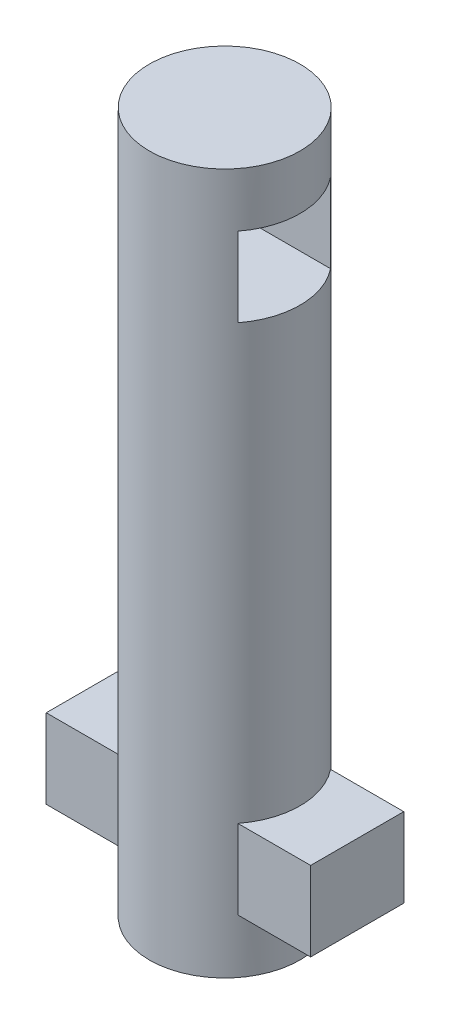
ISO-10303-21;
HEADER;
FILE_DESCRIPTION(('STEP AP214'),'2;1');
FILE_NAME('part.step','',(''),(''),'','','');
FILE_SCHEMA(('AUTOMOTIVE_DESIGN { 1 0 10303 214 1 1 1 1 }'));
ENDSEC;
DATA;
#1=APPLICATION_CONTEXT('core data for automotive mechanical design processes');
#2=APPLICATION_PROTOCOL_DEFINITION('international standard','automotive_design',2000,#1);
#3=PRODUCT_CONTEXT('',#1,'mechanical');
#4=PRODUCT('Part','Part','',(#3));
#5=PRODUCT_RELATED_PRODUCT_CATEGORY('part','',(#4));
#6=PRODUCT_DEFINITION_FORMATION('','',#4);
#7=PRODUCT_DEFINITION_CONTEXT('part definition',#1,'design');
#8=PRODUCT_DEFINITION('design','',#6,#7);
#9=PRODUCT_DEFINITION_SHAPE('','',#8);
#10=(LENGTH_UNIT() NAMED_UNIT(*) SI_UNIT(.MILLI.,.METRE.));
#11=(NAMED_UNIT(*) PLANE_ANGLE_UNIT() SI_UNIT($,.RADIAN.));
#12=(NAMED_UNIT(*) SI_UNIT($,.STERADIAN.) SOLID_ANGLE_UNIT());
#13=UNCERTAINTY_MEASURE_WITH_UNIT(LENGTH_MEASURE(1.E-05),#10,'distance_accuracy_value','');
#14=(GEOMETRIC_REPRESENTATION_CONTEXT(3) GLOBAL_UNCERTAINTY_ASSIGNED_CONTEXT((#13)) GLOBAL_UNIT_ASSIGNED_CONTEXT((#10,
#11,#12)) REPRESENTATION_CONTEXT('',''));
#15=CARTESIAN_POINT('',(0.,0.,0.));
#16=DIRECTION('',(0.,0.,1.));
#17=DIRECTION('',(1.,0.,0.));
#18=AXIS2_PLACEMENT_3D('',#15,#16,#17);
#19=CARTESIAN_POINT('',(0.,53.,0.));
#20=DIRECTION('',(0.,-1.,0.));
#21=DIRECTION('',(0.,0.,-1.));
#22=AXIS2_PLACEMENT_3D('',#19,#20,#21);
#23=CYLINDRICAL_SURFACE('',#22,5.7);
#24=DIRECTION('',(0.,-1.,0.));
#25=VECTOR('',#24,1.);
#26=CARTESIAN_POINT('',(-4.4988887516808,53.,3.5));
#27=LINE('',#26,#25);
#28=CARTESIAN_POINT('',(-4.4988887516808,10.1,3.5));
#29=VERTEX_POINT('',#28);
#30=CARTESIAN_POINT('',(-4.4988887516808,4.1,3.5));
#31=VERTEX_POINT('',#30);
#32=EDGE_CURVE('E42',#29,#31,#27,.T.);
#33=ORIENTED_EDGE('',*,*,#32,.T.);
#34=CARTESIAN_POINT('',(0.,4.1,0.));
#35=DIRECTION('',(0.,-1.,0.));
#36=DIRECTION('',(0.,0.,-1.));
#37=AXIS2_PLACEMENT_3D('',#34,#35,#36);
#38=CIRCLE('',#37,5.7);
#39=CARTESIAN_POINT('',(-4.46310892252872,4.1,-3.54551247997303));
#40=VERTEX_POINT('',#39);
#41=EDGE_CURVE('E11',#31,#40,#38,.T.);
#42=ORIENTED_EDGE('',*,*,#41,.T.);
#43=DIRECTION('',(0.,-1.,0.));
#44=VECTOR('',#43,1.);
#45=CARTESIAN_POINT('',(-4.46310892252872,53.,-3.54551247997303));
#46=LINE('',#45,#44);
#47=CARTESIAN_POINT('',(-4.46310892252872,10.1,-3.54551247997303));
#48=VERTEX_POINT('',#47);
#49=EDGE_CURVE('E248',#48,#40,#46,.T.);
#50=ORIENTED_EDGE('',*,*,#49,.F.);
#51=CARTESIAN_POINT('',(0.,10.1,0.));
#52=DIRECTION('',(0.,-1.,0.));
#53=DIRECTION('',(0.,0.,-1.));
#54=AXIS2_PLACEMENT_3D('',#51,#52,#53);
#55=CIRCLE('',#54,5.7);
#56=EDGE_CURVE('E59',#29,#48,#55,.T.);
#57=ORIENTED_EDGE('',*,*,#56,.F.);
#58=EDGE_LOOP('',(#33,#42,#50,#57));
#59=FACE_BOUND('',#58,.T.);
#60=DIRECTION('',(0.,-1.,0.));
#61=VECTOR('',#60,1.);
#62=CARTESIAN_POINT('',(4.46310892252872,53.,-3.54551247997303));
#63=LINE('',#62,#61);
#64=CARTESIAN_POINT('',(4.46310892252872,4.1,-3.54551247997303));
#65=VERTEX_POINT('',#64);
#66=CARTESIAN_POINT('',(4.46310892252873,10.1,-3.54551247997303));
#67=VERTEX_POINT('',#66);
#68=EDGE_CURVE('E238',#65,#67,#63,.F.);
#69=ORIENTED_EDGE('',*,*,#68,.F.);
#70=CARTESIAN_POINT('',(4.4988887516808,4.1,3.5));
#71=VERTEX_POINT('',#70);
#72=EDGE_CURVE('E49',#65,#71,#38,.T.);
#73=ORIENTED_EDGE('',*,*,#72,.T.);
#74=DIRECTION('',(0.,-1.,0.));
#75=VECTOR('',#74,1.);
#76=CARTESIAN_POINT('',(4.4988887516808,53.,3.5));
#77=LINE('',#76,#75);
#78=CARTESIAN_POINT('',(4.4988887516808,10.1,3.5));
#79=VERTEX_POINT('',#78);
#80=EDGE_CURVE('E245',#71,#79,#77,.F.);
#81=ORIENTED_EDGE('',*,*,#80,.T.);
#82=EDGE_CURVE('E241',#67,#79,#55,.T.);
#83=ORIENTED_EDGE('',*,*,#82,.F.);
#84=EDGE_LOOP('',(#69,#73,#81,#83));
#85=FACE_BOUND('',#84,.T.);
#86=DIRECTION('',(0.,-1.,0.));
#87=VECTOR('',#86,1.);
#88=CARTESIAN_POINT('',(4.4988887516808,53.,3.5));
#89=LINE('',#88,#87);
#90=CARTESIAN_POINT('',(4.4988887516808,42.9,3.5));
#91=VERTEX_POINT('',#90);
#92=CARTESIAN_POINT('',(4.4988887516808,48.9,3.5));
#93=VERTEX_POINT('',#92);
#94=EDGE_CURVE('E230',#91,#93,#89,.F.);
#95=ORIENTED_EDGE('',*,*,#94,.T.);
#96=CARTESIAN_POINT('',(0.,48.9,0.));
#97=DIRECTION('',(0.,1.,0.));
#98=DIRECTION('',(0.,0.,1.));
#99=AXIS2_PLACEMENT_3D('',#96,#97,#98);
#100=CIRCLE('',#99,5.7);
#101=CARTESIAN_POINT('',(4.46310892252872,48.9,-3.54551247997303));
#102=VERTEX_POINT('',#101);
#103=EDGE_CURVE('E218',#93,#102,#100,.T.);
#104=ORIENTED_EDGE('',*,*,#103,.T.);
#105=DIRECTION('',(0.,-1.,0.));
#106=VECTOR('',#105,1.);
#107=CARTESIAN_POINT('',(4.46310892252872,53.,-3.54551247997303));
#108=LINE('',#107,#106);
#109=CARTESIAN_POINT('',(4.46310892252872,42.9,-3.54551247997303));
#110=VERTEX_POINT('',#109);
#111=EDGE_CURVE('E226',#110,#102,#108,.F.);
#112=ORIENTED_EDGE('',*,*,#111,.F.);
#113=CARTESIAN_POINT('',(0.,42.9,0.));
#114=DIRECTION('',(0.,1.,0.));
#115=DIRECTION('',(0.,0.,1.));
#116=AXIS2_PLACEMENT_3D('',#113,#114,#115);
#117=CIRCLE('',#116,5.7);
#118=EDGE_CURVE('E222',#91,#110,#117,.T.);
#119=ORIENTED_EDGE('',*,*,#118,.F.);
#120=EDGE_LOOP('',(#95,#104,#112,#119));
#121=FACE_BOUND('',#120,.T.);
#122=CARTESIAN_POINT('',(0.,53.,0.));
#123=DIRECTION('',(0.,1.,0.));
#124=DIRECTION('',(0.,0.,1.));
#125=AXIS2_PLACEMENT_3D('',#122,#123,#124);
#126=CIRCLE('',#125,5.7);
#127=CARTESIAN_POINT('',(0.,53.,5.7));
#128=VERTEX_POINT('',#127);
#129=EDGE_CURVE('E206',#128,#128,#126,.T.);
#130=ORIENTED_EDGE('',*,*,#129,.F.);
#131=EDGE_LOOP('',(#130));
#132=FACE_BOUND('',#131,.T.);
#133=CARTESIAN_POINT('',(0.,0.,0.));
#134=DIRECTION('',(0.,1.,0.));
#135=DIRECTION('',(0.,0.,1.));
#136=AXIS2_PLACEMENT_3D('',#133,#134,#135);
#137=CIRCLE('',#136,5.7);
#138=CARTESIAN_POINT('',(0.,0.,5.7));
#139=VERTEX_POINT('',#138);
#140=EDGE_CURVE('E195',#139,#139,#137,.T.);
#141=ORIENTED_EDGE('',*,*,#140,.T.);
#142=EDGE_LOOP('',(#141));
#143=FACE_BOUND('',#142,.T.);
#144=CARTESIAN_POINT('',(-4.46310892252872,42.9,-3.54551247997303));
#145=VERTEX_POINT('',#144);
#146=CARTESIAN_POINT('',(-4.4988887516808,42.9,3.5));
#147=VERTEX_POINT('',#146);
#148=EDGE_CURVE('E217',#145,#147,#117,.T.);
#149=ORIENTED_EDGE('',*,*,#148,.F.);
#150=DIRECTION('',(0.,-1.,0.));
#151=VECTOR('',#150,1.);
#152=CARTESIAN_POINT('',(-4.46310892252872,53.,-3.54551247997303));
#153=LINE('',#152,#151);
#154=CARTESIAN_POINT('',(-4.46310892252872,48.9,-3.54551247997303));
#155=VERTEX_POINT('',#154);
#156=EDGE_CURVE('E234',#155,#145,#153,.T.);
#157=ORIENTED_EDGE('',*,*,#156,.F.);
#158=CARTESIAN_POINT('',(-4.4988887516808,48.9,3.5));
#159=VERTEX_POINT('',#158);
#160=EDGE_CURVE('E210',#155,#159,#100,.T.);
#161=ORIENTED_EDGE('',*,*,#160,.T.);
#162=DIRECTION('',(0.,-1.,0.));
#163=VECTOR('',#162,1.);
#164=CARTESIAN_POINT('',(-4.4988887516808,53.,3.5));
#165=LINE('',#164,#163);
#166=EDGE_CURVE('E221',#159,#147,#165,.T.);
#167=ORIENTED_EDGE('',*,*,#166,.T.);
#168=EDGE_LOOP('',(#149,#157,#161,#167));
#169=FACE_BOUND('',#168,.T.);
#170=ADVANCED_FACE('F39',(#59,#85,#121,#132,#143,#169),#23,.T.);
#171=CARTESIAN_POINT('',(0.,53.,0.));
#172=DIRECTION('',(0.,1.,0.));
#173=DIRECTION('',(0.,0.,1.));
#174=AXIS2_PLACEMENT_3D('',#171,#172,#173);
#175=PLANE('',#174);
#176=ORIENTED_EDGE('',*,*,#129,.T.);
#177=EDGE_LOOP('',(#176));
#178=FACE_BOUND('',#177,.T.);
#179=ADVANCED_FACE('F271',(#178),#175,.T.);
#180=CARTESIAN_POINT('',(0.,0.,0.));
#181=DIRECTION('',(0.,1.,0.));
#182=DIRECTION('',(0.,0.,1.));
#183=AXIS2_PLACEMENT_3D('',#180,#181,#182);
#184=PLANE('',#183);
#185=ORIENTED_EDGE('',*,*,#140,.F.);
#186=EDGE_LOOP('',(#185));
#187=FACE_BOUND('',#186,.T.);
#188=ADVANCED_FACE('F407',(#187),#184,.F.);
#189=CARTESIAN_POINT('',(5.7,42.9,3.5));
#190=DIRECTION('',(0.,0.,1.));
#191=DIRECTION('',(0.,-1.,0.));
#192=AXIS2_PLACEMENT_3D('',#189,#190,#191);
#193=PLANE('',#192);
#194=DIRECTION('',(-1.,0.,0.));
#195=VECTOR('',#194,1.);
#196=CARTESIAN_POINT('',(5.7,48.9,3.5));
#197=LINE('',#196,#195);
#198=EDGE_CURVE('E178',#93,#159,#197,.T.);
#199=ORIENTED_EDGE('',*,*,#198,.F.);
#200=ORIENTED_EDGE('',*,*,#94,.F.);
#201=DIRECTION('',(-1.,0.,0.));
#202=VECTOR('',#201,1.);
#203=CARTESIAN_POINT('',(5.7,42.9,3.5));
#204=LINE('',#203,#202);
#205=EDGE_CURVE('E191',#91,#147,#204,.T.);
#206=ORIENTED_EDGE('',*,*,#205,.T.);
#207=ORIENTED_EDGE('',*,*,#166,.F.);
#208=EDGE_LOOP('',(#199,#200,#206,#207));
#209=FACE_BOUND('',#208,.T.);
#210=ADVANCED_FACE('F399',(#209),#193,.F.);
#211=CARTESIAN_POINT('',(5.7,42.9,3.5));
#212=DIRECTION('',(0.,1.,0.));
#213=DIRECTION('',(0.,0.,1.));
#214=AXIS2_PLACEMENT_3D('',#211,#212,#213);
#215=PLANE('',#214);
#216=ORIENTED_EDGE('',*,*,#205,.F.);
#217=ORIENTED_EDGE('',*,*,#118,.T.);
#218=DIRECTION('',(-1.,0.,0.));
#219=VECTOR('',#218,1.);
#220=CARTESIAN_POINT('',(5.7,42.9,-3.54551247997303));
#221=LINE('',#220,#219);
#222=EDGE_CURVE('E196',#110,#145,#221,.T.);
#223=ORIENTED_EDGE('',*,*,#222,.T.);
#224=ORIENTED_EDGE('',*,*,#148,.T.);
#225=EDGE_LOOP('',(#216,#217,#223,#224));
#226=FACE_BOUND('',#225,.T.);
#227=ADVANCED_FACE('F288',(#226),#215,.T.);
#228=CARTESIAN_POINT('',(5.7,42.9,-3.54551247997303));
#229=DIRECTION('',(0.,0.,1.));
#230=DIRECTION('',(1.,0.,0.));
#231=AXIS2_PLACEMENT_3D('',#228,#229,#230);
#232=PLANE('',#231);
#233=ORIENTED_EDGE('',*,*,#156,.T.);
#234=ORIENTED_EDGE('',*,*,#222,.F.);
#235=ORIENTED_EDGE('',*,*,#111,.T.);
#236=DIRECTION('',(-1.,0.,0.));
#237=VECTOR('',#236,1.);
#238=CARTESIAN_POINT('',(5.7,48.9,-3.54551247997303));
#239=LINE('',#238,#237);
#240=EDGE_CURVE('E200',#102,#155,#239,.T.);
#241=ORIENTED_EDGE('',*,*,#240,.T.);
#242=EDGE_LOOP('',(#233,#234,#235,#241));
#243=FACE_BOUND('',#242,.T.);
#244=ADVANCED_FACE('F286',(#243),#232,.T.);
#245=CARTESIAN_POINT('',(5.7,48.9,3.5));
#246=DIRECTION('',(0.,1.,0.));
#247=DIRECTION('',(0.,0.,1.));
#248=AXIS2_PLACEMENT_3D('',#245,#246,#247);
#249=PLANE('',#248);
#250=ORIENTED_EDGE('',*,*,#198,.T.);
#251=ORIENTED_EDGE('',*,*,#160,.F.);
#252=ORIENTED_EDGE('',*,*,#240,.F.);
#253=ORIENTED_EDGE('',*,*,#103,.F.);
#254=EDGE_LOOP('',(#250,#251,#252,#253));
#255=FACE_BOUND('',#254,.T.);
#256=ADVANCED_FACE('F321',(#255),#249,.F.);
#257=CARTESIAN_POINT('',(10.,0.,0.));
#258=DIRECTION('',(-1.,0.,0.));
#259=DIRECTION('',(0.,0.,1.));
#260=AXIS2_PLACEMENT_3D('',#257,#258,#259);
#261=PLANE('',#260);
#262=DIRECTION('',(0.,0.,-1.));
#263=VECTOR('',#262,1.);
#264=CARTESIAN_POINT('',(10.,4.1,3.5));
#265=LINE('',#264,#263);
#266=CARTESIAN_POINT('',(10.,4.1,3.5));
#267=VERTEX_POINT('',#266);
#268=CARTESIAN_POINT('',(10.,4.1,-3.54551247997303));
#269=VERTEX_POINT('',#268);
#270=EDGE_CURVE('E131',#267,#269,#265,.T.);
#271=ORIENTED_EDGE('',*,*,#270,.T.);
#272=DIRECTION('',(0.,-1.,0.));
#273=VECTOR('',#272,1.);
#274=CARTESIAN_POINT('',(10.,10.1,-3.54551247997303));
#275=LINE('',#274,#273);
#276=CARTESIAN_POINT('',(10.,10.1,-3.54551247997303));
#277=VERTEX_POINT('',#276);
#278=EDGE_CURVE('E144',#277,#269,#275,.T.);
#279=ORIENTED_EDGE('',*,*,#278,.F.);
#280=DIRECTION('',(0.,0.,-1.));
#281=VECTOR('',#280,1.);
#282=CARTESIAN_POINT('',(10.,10.1,3.5));
#283=LINE('',#282,#281);
#284=CARTESIAN_POINT('',(10.,10.1,3.5));
#285=VERTEX_POINT('',#284);
#286=EDGE_CURVE('E154',#285,#277,#283,.T.);
#287=ORIENTED_EDGE('',*,*,#286,.F.);
#288=DIRECTION('',(0.,-1.,0.));
#289=VECTOR('',#288,1.);
#290=CARTESIAN_POINT('',(10.,10.1,3.5));
#291=LINE('',#290,#289);
#292=EDGE_CURVE('E147',#285,#267,#291,.T.);
#293=ORIENTED_EDGE('',*,*,#292,.T.);
#294=EDGE_LOOP('',(#271,#279,#287,#293));
#295=FACE_BOUND('',#294,.T.);
#296=ADVANCED_FACE('F142',(#295),#261,.F.);
#297=CARTESIAN_POINT('',(-10.,10.1,-3.54551247997303));
#298=DIRECTION('',(0.,0.,1.));
#299=DIRECTION('',(1.,0.,0.));
#300=AXIS2_PLACEMENT_3D('',#297,#298,#299);
#301=PLANE('',#300);
#302=DIRECTION('',(1.,0.,0.));
#303=VECTOR('',#302,1.);
#304=CARTESIAN_POINT('',(-10.,4.1,-3.54551247997303));
#305=LINE('',#304,#303);
#306=EDGE_CURVE('E127',#65,#269,#305,.T.);
#307=ORIENTED_EDGE('',*,*,#306,.F.);
#308=ORIENTED_EDGE('',*,*,#68,.T.);
#309=DIRECTION('',(1.,0.,0.));
#310=VECTOR('',#309,1.);
#311=CARTESIAN_POINT('',(-10.,10.1,-3.54551247997303));
#312=LINE('',#311,#310);
#313=EDGE_CURVE('E152',#67,#277,#312,.T.);
#314=ORIENTED_EDGE('',*,*,#313,.T.);
#315=ORIENTED_EDGE('',*,*,#278,.T.);
#316=EDGE_LOOP('',(#307,#308,#314,#315));
#317=FACE_BOUND('',#316,.T.);
#318=ADVANCED_FACE('F150',(#317),#301,.F.);
#319=CARTESIAN_POINT('',(-10.,10.1,3.5));
#320=DIRECTION('',(0.,-1.,0.));
#321=DIRECTION('',(0.,0.,-1.));
#322=AXIS2_PLACEMENT_3D('',#319,#320,#321);
#323=PLANE('',#322);
#324=ORIENTED_EDGE('',*,*,#313,.F.);
#325=ORIENTED_EDGE('',*,*,#82,.T.);
#326=DIRECTION('',(1.,0.,0.));
#327=VECTOR('',#326,1.);
#328=CARTESIAN_POINT('',(-10.,10.1,3.5));
#329=LINE('',#328,#327);
#330=EDGE_CURVE('E184',#79,#285,#329,.T.);
#331=ORIENTED_EDGE('',*,*,#330,.T.);
#332=ORIENTED_EDGE('',*,*,#286,.T.);
#333=EDGE_LOOP('',(#324,#325,#331,#332));
#334=FACE_BOUND('',#333,.T.);
#335=ADVANCED_FACE('F296',(#334),#323,.F.);
#336=CARTESIAN_POINT('',(-10.,10.1,3.5));
#337=DIRECTION('',(0.,0.,1.));
#338=DIRECTION('',(1.,0.,0.));
#339=AXIS2_PLACEMENT_3D('',#336,#337,#338);
#340=PLANE('',#339);
#341=ORIENTED_EDGE('',*,*,#80,.F.);
#342=DIRECTION('',(1.,0.,0.));
#343=VECTOR('',#342,1.);
#344=CARTESIAN_POINT('',(-10.,4.1,3.5));
#345=LINE('',#344,#343);
#346=EDGE_CURVE('E179',#71,#267,#345,.T.);
#347=ORIENTED_EDGE('',*,*,#346,.T.);
#348=ORIENTED_EDGE('',*,*,#292,.F.);
#349=ORIENTED_EDGE('',*,*,#330,.F.);
#350=EDGE_LOOP('',(#341,#347,#348,#349));
#351=FACE_BOUND('',#350,.T.);
#352=ADVANCED_FACE('F299',(#351),#340,.T.);
#353=CARTESIAN_POINT('',(-10.,4.1,3.5));
#354=DIRECTION('',(0.,-1.,0.));
#355=DIRECTION('',(0.,0.,-1.));
#356=AXIS2_PLACEMENT_3D('',#353,#354,#355);
#357=PLANE('',#356);
#358=ORIENTED_EDGE('',*,*,#72,.F.);
#359=ORIENTED_EDGE('',*,*,#306,.T.);
#360=ORIENTED_EDGE('',*,*,#270,.F.);
#361=ORIENTED_EDGE('',*,*,#346,.F.);
#362=EDGE_LOOP('',(#358,#359,#360,#361));
#363=FACE_BOUND('',#362,.T.);
#364=ADVANCED_FACE('F129',(#363),#357,.T.);
#365=ORIENTED_EDGE('',*,*,#32,.F.);
#366=CARTESIAN_POINT('',(-10.,10.1,3.5));
#367=VERTEX_POINT('',#366);
#368=EDGE_CURVE('E180',#367,#29,#329,.T.);
#369=ORIENTED_EDGE('',*,*,#368,.F.);
#370=DIRECTION('',(0.,-1.,0.));
#371=VECTOR('',#370,1.);
#372=CARTESIAN_POINT('',(-10.,10.1,3.5));
#373=LINE('',#372,#371);
#374=CARTESIAN_POINT('',(-10.,4.1,3.5));
#375=VERTEX_POINT('',#374);
#376=EDGE_CURVE('E137',#367,#375,#373,.T.);
#377=ORIENTED_EDGE('',*,*,#376,.T.);
#378=EDGE_CURVE('E174',#375,#31,#345,.T.);
#379=ORIENTED_EDGE('',*,*,#378,.T.);
#380=EDGE_LOOP('',(#365,#369,#377,#379));
#381=FACE_BOUND('',#380,.T.);
#382=ADVANCED_FACE('F266',(#381),#340,.T.);
#383=CARTESIAN_POINT('',(-10.,10.1,-3.54551247997303));
#384=VERTEX_POINT('',#383);
#385=EDGE_CURVE('E185',#384,#48,#312,.T.);
#386=ORIENTED_EDGE('',*,*,#385,.T.);
#387=ORIENTED_EDGE('',*,*,#49,.T.);
#388=CARTESIAN_POINT('',(-10.,4.1,-3.54551247997303));
#389=VERTEX_POINT('',#388);
#390=EDGE_CURVE('E136',#389,#40,#305,.T.);
#391=ORIENTED_EDGE('',*,*,#390,.F.);
#392=DIRECTION('',(0.,-1.,0.));
#393=VECTOR('',#392,1.);
#394=CARTESIAN_POINT('',(-10.,10.1,-3.54551247997303));
#395=LINE('',#394,#393);
#396=EDGE_CURVE('E165',#384,#389,#395,.T.);
#397=ORIENTED_EDGE('',*,*,#396,.F.);
#398=EDGE_LOOP('',(#386,#387,#391,#397));
#399=FACE_BOUND('',#398,.T.);
#400=ADVANCED_FACE('F260',(#399),#301,.F.);
#401=ORIENTED_EDGE('',*,*,#41,.F.);
#402=ORIENTED_EDGE('',*,*,#378,.F.);
#403=DIRECTION('',(0.,0.,-1.));
#404=VECTOR('',#403,1.);
#405=CARTESIAN_POINT('',(-10.,4.1,3.5));
#406=LINE('',#405,#404);
#407=EDGE_CURVE('E161',#375,#389,#406,.T.);
#408=ORIENTED_EDGE('',*,*,#407,.T.);
#409=ORIENTED_EDGE('',*,*,#390,.T.);
#410=EDGE_LOOP('',(#401,#402,#408,#409));
#411=FACE_BOUND('',#410,.T.);
#412=ADVANCED_FACE('F268',(#411),#357,.T.);
#413=ORIENTED_EDGE('',*,*,#368,.T.);
#414=ORIENTED_EDGE('',*,*,#56,.T.);
#415=ORIENTED_EDGE('',*,*,#385,.F.);
#416=DIRECTION('',(0.,0.,-1.));
#417=VECTOR('',#416,1.);
#418=CARTESIAN_POINT('',(-10.,10.1,3.5));
#419=LINE('',#418,#417);
#420=EDGE_CURVE('E168',#367,#384,#419,.T.);
#421=ORIENTED_EDGE('',*,*,#420,.F.);
#422=EDGE_LOOP('',(#413,#414,#415,#421));
#423=FACE_BOUND('',#422,.T.);
#424=ADVANCED_FACE('F257',(#423),#323,.F.);
#425=CARTESIAN_POINT('',(-10.,0.,0.));
#426=DIRECTION('',(-1.,0.,0.));
#427=DIRECTION('',(0.,0.,1.));
#428=AXIS2_PLACEMENT_3D('',#425,#426,#427);
#429=PLANE('',#428);
#430=ORIENTED_EDGE('',*,*,#407,.F.);
#431=ORIENTED_EDGE('',*,*,#376,.F.);
#432=ORIENTED_EDGE('',*,*,#420,.T.);
#433=ORIENTED_EDGE('',*,*,#396,.T.);
#434=EDGE_LOOP('',(#430,#431,#432,#433));
#435=FACE_BOUND('',#434,.T.);
#436=ADVANCED_FACE('F263',(#435),#429,.T.);
#437=CLOSED_SHELL('',(#170,#179,#188,#210,#227,#244,#256,#296,#318,#335,#352,#364,#382,#400,
#412,#424,#436));
#438=MANIFOLD_SOLID_BREP('B2',#437);
#439=ADVANCED_BREP_SHAPE_REPRESENTATION('',(#18,#438),#14);
#440=SHAPE_DEFINITION_REPRESENTATION(#9,#439);
ENDSEC;
END-ISO-10303-21;
